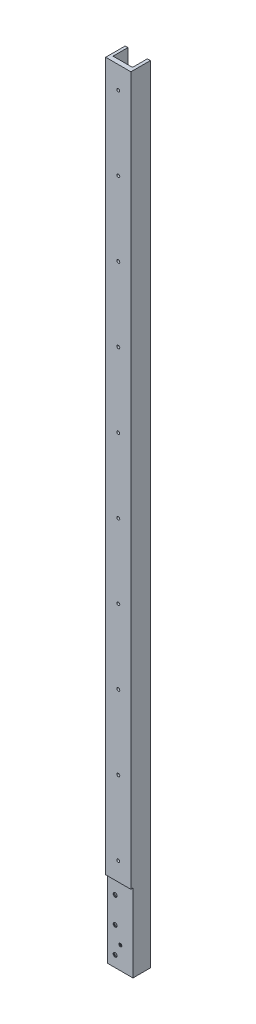
ISO-10303-21;
HEADER;
FILE_DESCRIPTION(('STEP AP214'),'2;1');
FILE_NAME('part.step','',(''),(''),'','','');
FILE_SCHEMA(('AUTOMOTIVE_DESIGN { 1 0 10303 214 1 1 1 1 }'));
ENDSEC;
DATA;
#1=APPLICATION_CONTEXT('core data for automotive mechanical design processes');
#2=APPLICATION_PROTOCOL_DEFINITION('international standard','automotive_design',2000,#1);
#3=PRODUCT_CONTEXT('',#1,'mechanical');
#4=PRODUCT('Part','Part','',(#3));
#5=PRODUCT_RELATED_PRODUCT_CATEGORY('part','',(#4));
#6=PRODUCT_DEFINITION_FORMATION('','',#4);
#7=PRODUCT_DEFINITION_CONTEXT('part definition',#1,'design');
#8=PRODUCT_DEFINITION('design','',#6,#7);
#9=PRODUCT_DEFINITION_SHAPE('','',#8);
#10=(LENGTH_UNIT() NAMED_UNIT(*) SI_UNIT(.MILLI.,.METRE.));
#11=(NAMED_UNIT(*) PLANE_ANGLE_UNIT() SI_UNIT($,.RADIAN.));
#12=(NAMED_UNIT(*) SI_UNIT($,.STERADIAN.) SOLID_ANGLE_UNIT());
#13=UNCERTAINTY_MEASURE_WITH_UNIT(LENGTH_MEASURE(1.E-05),#10,'distance_accuracy_value','');
#14=(GEOMETRIC_REPRESENTATION_CONTEXT(3) GLOBAL_UNCERTAINTY_ASSIGNED_CONTEXT((#13)) GLOBAL_UNIT_ASSIGNED_CONTEXT((#10,
#11,#12)) REPRESENTATION_CONTEXT('',''));
#15=CARTESIAN_POINT('',(0.,0.,0.));
#16=DIRECTION('',(0.,0.,1.));
#17=DIRECTION('',(1.,0.,0.));
#18=AXIS2_PLACEMENT_3D('',#15,#16,#17);
#19=CARTESIAN_POINT('',(-43.18,-1221.28003368592,33.3248));
#20=DIRECTION('',(1.,0.,0.));
#21=DIRECTION('',(0.,0.,-1.));
#22=AXIS2_PLACEMENT_3D('',#19,#20,#21);
#23=PLANE('',#22);
#24=DIRECTION('',(0.,0.,-1.));
#25=VECTOR('',#24,1.);
#26=CARTESIAN_POINT('',(-43.18,-1087.93003368592,33.3248));
#27=LINE('',#26,#25);
#28=CARTESIAN_POINT('',(-43.18,-1087.93003368592,33.3248));
#29=VERTEX_POINT('',#28);
#30=CARTESIAN_POINT('',(-43.18,-1087.93003368592,29.7688));
#31=VERTEX_POINT('',#30);
#32=EDGE_CURVE('E121',#29,#31,#27,.T.);
#33=ORIENTED_EDGE('',*,*,#32,.F.);
#34=DIRECTION('',(0.,-1.,0.));
#35=VECTOR('',#34,1.);
#36=CARTESIAN_POINT('',(-43.18,-1221.28003368592,33.3248));
#37=LINE('',#36,#35);
#38=CARTESIAN_POINT('',(-43.18,124.919966314081,33.3248));
#39=VERTEX_POINT('',#38);
#40=EDGE_CURVE('E289',#39,#29,#37,.T.);
#41=ORIENTED_EDGE('',*,*,#40,.F.);
#42=DIRECTION('',(0.,0.,-1.));
#43=VECTOR('',#42,1.);
#44=CARTESIAN_POINT('',(-43.18,124.919966314081,33.3248));
#45=LINE('',#44,#43);
#46=CARTESIAN_POINT('',(-43.18,124.919966314081,0.));
#47=VERTEX_POINT('',#46);
#48=EDGE_CURVE('E297',#39,#47,#45,.T.);
#49=ORIENTED_EDGE('',*,*,#48,.T.);
#50=DIRECTION('',(0.,-1.,0.));
#51=VECTOR('',#50,1.);
#52=CARTESIAN_POINT('',(-43.18,-1221.28003368592,0.));
#53=LINE('',#52,#51);
#54=CARTESIAN_POINT('',(-43.18,-1221.28003368592,0.));
#55=VERTEX_POINT('',#54);
#56=EDGE_CURVE('E135',#47,#55,#53,.T.);
#57=ORIENTED_EDGE('',*,*,#56,.T.);
#58=DIRECTION('',(0.,0.,-1.));
#59=VECTOR('',#58,1.);
#60=CARTESIAN_POINT('',(-43.18,-1221.28003368592,33.3248));
#61=LINE('',#60,#59);
#62=CARTESIAN_POINT('',(-43.18,-1221.28003368592,29.7688));
#63=VERTEX_POINT('',#62);
#64=EDGE_CURVE('E127',#63,#55,#61,.T.);
#65=ORIENTED_EDGE('',*,*,#64,.F.);
#66=DIRECTION('',(0.,1.,0.));
#67=VECTOR('',#66,1.);
#68=CARTESIAN_POINT('',(-43.18,-1221.28003368592,29.7688));
#69=LINE('',#68,#67);
#70=EDGE_CURVE('E110',#63,#31,#69,.T.);
#71=ORIENTED_EDGE('',*,*,#70,.T.);
#72=EDGE_LOOP('',(#33,#41,#49,#57,#65,#71));
#73=FACE_BOUND('',#72,.T.);
#74=ADVANCED_FACE('F33',(#73),#23,.F.);
#75=CARTESIAN_POINT('',(0.,-1221.28003368592,33.3248));
#76=DIRECTION('',(-1.,0.,0.));
#77=DIRECTION('',(0.,0.,1.));
#78=AXIS2_PLACEMENT_3D('',#75,#76,#77);
#79=PLANE('',#78);
#80=DIRECTION('',(0.,0.,-1.));
#81=VECTOR('',#80,1.);
#82=CARTESIAN_POINT('',(0.,-1087.93003368592,33.3248));
#83=LINE('',#82,#81);
#84=CARTESIAN_POINT('',(0.,-1087.93003368592,33.3248));
#85=VERTEX_POINT('',#84);
#86=CARTESIAN_POINT('',(0.,-1087.93003368592,29.7688));
#87=VERTEX_POINT('',#86);
#88=EDGE_CURVE('E49',#85,#87,#83,.T.);
#89=ORIENTED_EDGE('',*,*,#88,.T.);
#90=DIRECTION('',(0.,1.,0.));
#91=VECTOR('',#90,1.);
#92=CARTESIAN_POINT('',(0.,-1221.28003368592,29.7688));
#93=LINE('',#92,#91);
#94=CARTESIAN_POINT('',(0.,-1221.28003368592,29.7688));
#95=VERTEX_POINT('',#94);
#96=EDGE_CURVE('E199',#95,#87,#93,.T.);
#97=ORIENTED_EDGE('',*,*,#96,.F.);
#98=DIRECTION('',(0.,0.,-1.));
#99=VECTOR('',#98,1.);
#100=CARTESIAN_POINT('',(0.,-1221.28003368592,33.3248));
#101=LINE('',#100,#99);
#102=CARTESIAN_POINT('',(0.,-1221.28003368592,0.));
#103=VERTEX_POINT('',#102);
#104=EDGE_CURVE('E130',#95,#103,#101,.T.);
#105=ORIENTED_EDGE('',*,*,#104,.T.);
#106=DIRECTION('',(0.,1.,0.));
#107=VECTOR('',#106,1.);
#108=CARTESIAN_POINT('',(0.,-1221.28003368592,0.));
#109=LINE('',#108,#107);
#110=CARTESIAN_POINT('',(0.,124.919966314081,0.));
#111=VERTEX_POINT('',#110);
#112=EDGE_CURVE('E302',#103,#111,#109,.T.);
#113=ORIENTED_EDGE('',*,*,#112,.T.);
#114=DIRECTION('',(0.,0.,-1.));
#115=VECTOR('',#114,1.);
#116=CARTESIAN_POINT('',(0.,124.919966314081,33.3248));
#117=LINE('',#116,#115);
#118=CARTESIAN_POINT('',(0.,124.919966314081,33.3248));
#119=VERTEX_POINT('',#118);
#120=EDGE_CURVE('E138',#119,#111,#117,.T.);
#121=ORIENTED_EDGE('',*,*,#120,.F.);
#122=DIRECTION('',(0.,1.,0.));
#123=VECTOR('',#122,1.);
#124=CARTESIAN_POINT('',(0.,-1221.28003368592,33.3248));
#125=LINE('',#124,#123);
#126=EDGE_CURVE('E292',#85,#119,#125,.T.);
#127=ORIENTED_EDGE('',*,*,#126,.F.);
#128=EDGE_LOOP('',(#89,#97,#105,#113,#121,#127));
#129=FACE_BOUND('',#128,.T.);
#130=ADVANCED_FACE('F345',(#129),#79,.F.);
#131=CARTESIAN_POINT('',(0.,0.,33.3248));
#132=DIRECTION('',(0.,0.,-1.));
#133=DIRECTION('',(-1.,0.,0.));
#134=AXIS2_PLACEMENT_3D('',#131,#132,#133);
#135=PLANE('',#134);
#136=CARTESIAN_POINT('',(-21.5900000000044,86.8199663140807,33.3248));
#137=DIRECTION('',(0.,0.,-1.));
#138=DIRECTION('',(-1.,0.,0.));
#139=AXIS2_PLACEMENT_3D('',#136,#137,#138);
#140=CIRCLE('',#139,2.55269999999998);
#141=CARTESIAN_POINT('',(-24.1427000000044,86.8199663140807,33.3248));
#142=VERTEX_POINT('',#141);
#143=EDGE_CURVE('E142',#142,#142,#140,.T.);
#144=ORIENTED_EDGE('',*,*,#143,.T.);
#145=EDGE_LOOP('',(#144));
#146=FACE_BOUND('',#145,.T.);
#147=CARTESIAN_POINT('',(-21.590000000004,-40.1800336859193,33.3248));
#148=DIRECTION('',(0.,0.,-1.));
#149=DIRECTION('',(-1.,0.,0.));
#150=AXIS2_PLACEMENT_3D('',#147,#148,#149);
#151=CIRCLE('',#150,2.55269999999998);
#152=CARTESIAN_POINT('',(-24.142700000004,-40.1800336859193,33.3248));
#153=VERTEX_POINT('',#152);
#154=EDGE_CURVE('E147',#153,#153,#151,.T.);
#155=ORIENTED_EDGE('',*,*,#154,.T.);
#156=EDGE_LOOP('',(#155));
#157=FACE_BOUND('',#156,.T.);
#158=CARTESIAN_POINT('',(-21.5900000000035,-167.180033685919,33.3248));
#159=DIRECTION('',(0.,0.,-1.));
#160=DIRECTION('',(-1.,0.,0.));
#161=AXIS2_PLACEMENT_3D('',#158,#159,#160);
#162=CIRCLE('',#161,2.55269999999998);
#163=CARTESIAN_POINT('',(-24.1427000000035,-167.180033685919,33.3248));
#164=VERTEX_POINT('',#163);
#165=EDGE_CURVE('E152',#164,#164,#162,.T.);
#166=ORIENTED_EDGE('',*,*,#165,.T.);
#167=EDGE_LOOP('',(#166));
#168=FACE_BOUND('',#167,.T.);
#169=CARTESIAN_POINT('',(-21.5900000000031,-294.180033685919,33.3248));
#170=DIRECTION('',(0.,0.,-1.));
#171=DIRECTION('',(-1.,0.,0.));
#172=AXIS2_PLACEMENT_3D('',#169,#170,#171);
#173=CIRCLE('',#172,2.55269999999998);
#174=CARTESIAN_POINT('',(-24.1427000000031,-294.180033685919,33.3248));
#175=VERTEX_POINT('',#174);
#176=EDGE_CURVE('E157',#175,#175,#173,.T.);
#177=ORIENTED_EDGE('',*,*,#176,.T.);
#178=EDGE_LOOP('',(#177));
#179=FACE_BOUND('',#178,.T.);
#180=CARTESIAN_POINT('',(-21.5900000000027,-421.180033685919,33.3248));
#181=DIRECTION('',(0.,0.,-1.));
#182=DIRECTION('',(-1.,0.,0.));
#183=AXIS2_PLACEMENT_3D('',#180,#181,#182);
#184=CIRCLE('',#183,2.55269999999998);
#185=CARTESIAN_POINT('',(-24.1427000000026,-421.180033685919,33.3248));
#186=VERTEX_POINT('',#185);
#187=EDGE_CURVE('E162',#186,#186,#184,.T.);
#188=ORIENTED_EDGE('',*,*,#187,.T.);
#189=EDGE_LOOP('',(#188));
#190=FACE_BOUND('',#189,.T.);
#191=CARTESIAN_POINT('',(-21.5900000000022,-548.180033685919,33.3248));
#192=DIRECTION('',(0.,0.,-1.));
#193=DIRECTION('',(-1.,0.,0.));
#194=AXIS2_PLACEMENT_3D('',#191,#192,#193);
#195=CIRCLE('',#194,2.55269999999998);
#196=CARTESIAN_POINT('',(-24.1427000000022,-548.180033685919,33.3248));
#197=VERTEX_POINT('',#196);
#198=EDGE_CURVE('E167',#197,#197,#195,.T.);
#199=ORIENTED_EDGE('',*,*,#198,.T.);
#200=EDGE_LOOP('',(#199));
#201=FACE_BOUND('',#200,.T.);
#202=CARTESIAN_POINT('',(-21.5900000000018,-675.180033685919,33.3248));
#203=DIRECTION('',(0.,0.,-1.));
#204=DIRECTION('',(-1.,0.,0.));
#205=AXIS2_PLACEMENT_3D('',#202,#203,#204);
#206=CIRCLE('',#205,2.55269999999998);
#207=CARTESIAN_POINT('',(-24.1427000000018,-675.180033685919,33.3248));
#208=VERTEX_POINT('',#207);
#209=EDGE_CURVE('E172',#208,#208,#206,.T.);
#210=ORIENTED_EDGE('',*,*,#209,.T.);
#211=EDGE_LOOP('',(#210));
#212=FACE_BOUND('',#211,.T.);
#213=CARTESIAN_POINT('',(-21.5900000000013,-802.180033685919,33.3248));
#214=DIRECTION('',(0.,0.,-1.));
#215=DIRECTION('',(-1.,0.,0.));
#216=AXIS2_PLACEMENT_3D('',#213,#214,#215);
#217=CIRCLE('',#216,2.55269999999998);
#218=CARTESIAN_POINT('',(-24.1427000000013,-802.180033685919,33.3248));
#219=VERTEX_POINT('',#218);
#220=EDGE_CURVE('E177',#219,#219,#217,.T.);
#221=ORIENTED_EDGE('',*,*,#220,.T.);
#222=EDGE_LOOP('',(#221));
#223=FACE_BOUND('',#222,.T.);
#224=CARTESIAN_POINT('',(-21.5900000000009,-929.180033685919,33.3248));
#225=DIRECTION('',(0.,0.,-1.));
#226=DIRECTION('',(-1.,0.,0.));
#227=AXIS2_PLACEMENT_3D('',#224,#225,#226);
#228=CIRCLE('',#227,2.55269999999998);
#229=CARTESIAN_POINT('',(-24.1427000000009,-929.180033685919,33.3248));
#230=VERTEX_POINT('',#229);
#231=EDGE_CURVE('E182',#230,#230,#228,.T.);
#232=ORIENTED_EDGE('',*,*,#231,.T.);
#233=EDGE_LOOP('',(#232));
#234=FACE_BOUND('',#233,.T.);
#235=CARTESIAN_POINT('',(-21.5900000000004,-1056.18003368592,33.3248));
#236=DIRECTION('',(0.,0.,-1.));
#237=DIRECTION('',(-1.,0.,0.));
#238=AXIS2_PLACEMENT_3D('',#235,#236,#237);
#239=CIRCLE('',#238,2.55269999999998);
#240=CARTESIAN_POINT('',(-24.1427000000004,-1056.18003368592,33.3248));
#241=VERTEX_POINT('',#240);
#242=EDGE_CURVE('E187',#241,#241,#239,.T.);
#243=ORIENTED_EDGE('',*,*,#242,.T.);
#244=EDGE_LOOP('',(#243));
#245=FACE_BOUND('',#244,.T.);
#246=DIRECTION('',(1.,0.,0.));
#247=VECTOR('',#246,1.);
#248=CARTESIAN_POINT('',(-43.18,-1087.93003368592,33.3248));
#249=LINE('',#248,#247);
#250=EDGE_CURVE('E196',#29,#85,#249,.T.);
#251=ORIENTED_EDGE('',*,*,#250,.T.);
#252=ORIENTED_EDGE('',*,*,#126,.T.);
#253=DIRECTION('',(-1.,0.,0.));
#254=VECTOR('',#253,1.);
#255=CARTESIAN_POINT('',(-43.18,124.919966314081,33.3248));
#256=LINE('',#255,#254);
#257=EDGE_CURVE('E295',#119,#39,#256,.T.);
#258=ORIENTED_EDGE('',*,*,#257,.T.);
#259=ORIENTED_EDGE('',*,*,#40,.T.);
#260=EDGE_LOOP('',(#251,#252,#258,#259));
#261=FACE_BOUND('',#260,.T.);
#262=ADVANCED_FACE('F350',(#146,#157,#168,#179,#190,#201,#212,#223,#234,#245,#261),#135,.F.);
#263=CARTESIAN_POINT('',(0.,0.,0.));
#264=DIRECTION('',(0.,0.,-1.));
#265=DIRECTION('',(-1.,0.,0.));
#266=AXIS2_PLACEMENT_3D('',#263,#264,#265);
#267=PLANE('',#266);
#268=DIRECTION('',(1.,0.,0.));
#269=VECTOR('',#268,1.);
#270=CARTESIAN_POINT('',(-43.18,-1221.28003368592,0.));
#271=LINE('',#270,#269);
#272=CARTESIAN_POINT('',(-5.1435,-1221.28003368592,0.));
#273=VERTEX_POINT('',#272);
#274=EDGE_CURVE('E299',#273,#103,#271,.T.);
#275=ORIENTED_EDGE('',*,*,#274,.F.);
#276=DIRECTION('',(0.,1.,0.));
#277=VECTOR('',#276,1.);
#278=CARTESIAN_POINT('',(-5.1435,0.,0.));
#279=LINE('',#278,#277);
#280=CARTESIAN_POINT('',(-5.1435,124.919966314081,0.));
#281=VERTEX_POINT('',#280);
#282=EDGE_CURVE('E41',#273,#281,#279,.T.);
#283=ORIENTED_EDGE('',*,*,#282,.T.);
#284=DIRECTION('',(-1.,0.,0.));
#285=VECTOR('',#284,1.);
#286=CARTESIAN_POINT('',(-43.18,124.919966314081,0.));
#287=LINE('',#286,#285);
#288=EDGE_CURVE('E293',#111,#281,#287,.T.);
#289=ORIENTED_EDGE('',*,*,#288,.F.);
#290=ORIENTED_EDGE('',*,*,#112,.F.);
#291=EDGE_LOOP('',(#275,#283,#289,#290));
#292=FACE_BOUND('',#291,.T.);
#293=ADVANCED_FACE('F320',(#292),#267,.T.);
#294=CARTESIAN_POINT('',(-43.18,-1221.28003368592,33.3248));
#295=DIRECTION('',(0.,1.,0.));
#296=DIRECTION('',(0.,0.,1.));
#297=AXIS2_PLACEMENT_3D('',#294,#295,#296);
#298=PLANE('',#297);
#299=ORIENTED_EDGE('',*,*,#104,.F.);
#300=DIRECTION('',(1.,0.,0.));
#301=VECTOR('',#300,1.);
#302=CARTESIAN_POINT('',(-43.18,-1221.28003368592,29.7688));
#303=LINE('',#302,#301);
#304=EDGE_CURVE('E115',#63,#95,#303,.T.);
#305=ORIENTED_EDGE('',*,*,#304,.F.);
#306=ORIENTED_EDGE('',*,*,#64,.T.);
#307=CARTESIAN_POINT('',(-38.481,-1221.28003368592,0.));
#308=VERTEX_POINT('',#307);
#309=EDGE_CURVE('E300',#55,#308,#271,.T.);
#310=ORIENTED_EDGE('',*,*,#309,.T.);
#311=DIRECTION('',(0.,0.,1.));
#312=VECTOR('',#311,1.);
#313=CARTESIAN_POINT('',(-38.481,-1221.28003368592,-7.73428244373345));
#314=LINE('',#313,#312);
#315=CARTESIAN_POINT('',(-38.481,-1221.28003368592,25.3873));
#316=VERTEX_POINT('',#315);
#317=EDGE_CURVE('E271',#308,#316,#314,.T.);
#318=ORIENTED_EDGE('',*,*,#317,.T.);
#319=DIRECTION('',(1.,0.,0.));
#320=VECTOR('',#319,1.);
#321=CARTESIAN_POINT('',(-38.481,-1221.28003368592,25.3873));
#322=LINE('',#321,#320);
#323=CARTESIAN_POINT('',(-5.1435,-1221.28003368592,25.3873));
#324=VERTEX_POINT('',#323);
#325=EDGE_CURVE('E274',#316,#324,#322,.T.);
#326=ORIENTED_EDGE('',*,*,#325,.T.);
#327=DIRECTION('',(0.,0.,1.));
#328=VECTOR('',#327,1.);
#329=CARTESIAN_POINT('',(-5.1435,-1221.28003368592,-7.73428244373345));
#330=LINE('',#329,#328);
#331=EDGE_CURVE('E277',#273,#324,#330,.T.);
#332=ORIENTED_EDGE('',*,*,#331,.F.);
#333=ORIENTED_EDGE('',*,*,#274,.T.);
#334=EDGE_LOOP('',(#299,#305,#306,#310,#318,#326,#332,#333));
#335=FACE_BOUND('',#334,.T.);
#336=ADVANCED_FACE('F125',(#335),#298,.F.);
#337=CARTESIAN_POINT('',(-43.18,124.919966314081,33.3248));
#338=DIRECTION('',(0.,-1.,0.));
#339=DIRECTION('',(0.,0.,-1.));
#340=AXIS2_PLACEMENT_3D('',#337,#338,#339);
#341=PLANE('',#340);
#342=DIRECTION('',(1.,0.,0.));
#343=VECTOR('',#342,1.);
#344=CARTESIAN_POINT('',(-38.481,124.919966314081,25.3873));
#345=LINE('',#344,#343);
#346=CARTESIAN_POINT('',(-38.481,124.919966314081,25.3873));
#347=VERTEX_POINT('',#346);
#348=CARTESIAN_POINT('',(-5.1435,124.919966314081,25.3873));
#349=VERTEX_POINT('',#348);
#350=EDGE_CURVE('E281',#347,#349,#345,.T.);
#351=ORIENTED_EDGE('',*,*,#350,.F.);
#352=DIRECTION('',(0.,0.,1.));
#353=VECTOR('',#352,1.);
#354=CARTESIAN_POINT('',(-38.481,124.919966314081,-7.73428244373345));
#355=LINE('',#354,#353);
#356=CARTESIAN_POINT('',(-38.481,124.919966314081,0.));
#357=VERTEX_POINT('',#356);
#358=EDGE_CURVE('E145',#357,#347,#355,.T.);
#359=ORIENTED_EDGE('',*,*,#358,.F.);
#360=EDGE_CURVE('E304',#357,#47,#287,.T.);
#361=ORIENTED_EDGE('',*,*,#360,.T.);
#362=ORIENTED_EDGE('',*,*,#48,.F.);
#363=ORIENTED_EDGE('',*,*,#257,.F.);
#364=ORIENTED_EDGE('',*,*,#120,.T.);
#365=ORIENTED_EDGE('',*,*,#288,.T.);
#366=DIRECTION('',(0.,0.,1.));
#367=VECTOR('',#366,1.);
#368=CARTESIAN_POINT('',(-5.1435,124.919966314081,-7.73428244373345));
#369=LINE('',#368,#367);
#370=EDGE_CURVE('E57',#281,#349,#369,.T.);
#371=ORIENTED_EDGE('',*,*,#370,.T.);
#372=EDGE_LOOP('',(#351,#359,#361,#362,#363,#364,#365,#371));
#373=FACE_BOUND('',#372,.T.);
#374=ADVANCED_FACE('F313',(#373),#341,.F.);
#375=DIRECTION('',(0.,1.,0.));
#376=VECTOR('',#375,1.);
#377=CARTESIAN_POINT('',(-38.481,0.,0.));
#378=LINE('',#377,#376);
#379=EDGE_CURVE('E11',#308,#357,#378,.T.);
#380=ORIENTED_EDGE('',*,*,#379,.F.);
#381=ORIENTED_EDGE('',*,*,#309,.F.);
#382=ORIENTED_EDGE('',*,*,#56,.F.);
#383=ORIENTED_EDGE('',*,*,#360,.F.);
#384=EDGE_LOOP('',(#380,#381,#382,#383));
#385=FACE_BOUND('',#384,.T.);
#386=ADVANCED_FACE('F332',(#385),#267,.T.);
#387=CARTESIAN_POINT('',(-38.481,-1221.28003368592,-7.73428244373345));
#388=DIRECTION('',(-1.,0.,0.));
#389=DIRECTION('',(0.,0.,1.));
#390=AXIS2_PLACEMENT_3D('',#387,#388,#389);
#391=PLANE('',#390);
#392=ORIENTED_EDGE('',*,*,#379,.T.);
#393=ORIENTED_EDGE('',*,*,#358,.T.);
#394=DIRECTION('',(0.,1.,0.));
#395=VECTOR('',#394,1.);
#396=CARTESIAN_POINT('',(-38.481,-1221.28003368592,25.3873));
#397=LINE('',#396,#395);
#398=EDGE_CURVE('E279',#316,#347,#397,.T.);
#399=ORIENTED_EDGE('',*,*,#398,.F.);
#400=ORIENTED_EDGE('',*,*,#317,.F.);
#401=EDGE_LOOP('',(#392,#393,#399,#400));
#402=FACE_BOUND('',#401,.T.);
#403=ADVANCED_FACE('F333',(#402),#391,.F.);
#404=CARTESIAN_POINT('',(-5.1435,-1221.28003368592,-7.73428244373345));
#405=DIRECTION('',(-1.,0.,0.));
#406=DIRECTION('',(0.,0.,1.));
#407=AXIS2_PLACEMENT_3D('',#404,#405,#406);
#408=PLANE('',#407);
#409=ORIENTED_EDGE('',*,*,#331,.T.);
#410=DIRECTION('',(0.,1.,0.));
#411=VECTOR('',#410,1.);
#412=CARTESIAN_POINT('',(-5.1435,-1221.28003368592,25.3873));
#413=LINE('',#412,#411);
#414=EDGE_CURVE('E285',#324,#349,#413,.T.);
#415=ORIENTED_EDGE('',*,*,#414,.T.);
#416=ORIENTED_EDGE('',*,*,#370,.F.);
#417=ORIENTED_EDGE('',*,*,#282,.F.);
#418=EDGE_LOOP('',(#409,#415,#416,#417));
#419=FACE_BOUND('',#418,.T.);
#420=ADVANCED_FACE('F322',(#419),#408,.T.);
#421=CARTESIAN_POINT('',(-38.481,-1221.28003368592,25.3873));
#422=DIRECTION('',(0.,0.,1.));
#423=DIRECTION('',(1.,0.,0.));
#424=AXIS2_PLACEMENT_3D('',#421,#422,#423);
#425=PLANE('',#424);
#426=CARTESIAN_POINT('',(-30.4799998896747,-1157.78003327334,25.3873));
#427=DIRECTION('',(0.,0.,-1.));
#428=DIRECTION('',(-1.,0.,0.));
#429=AXIS2_PLACEMENT_3D('',#426,#427,#428);
#430=CIRCLE('',#429,6.6597022);
#431=CARTESIAN_POINT('',(-37.1397020896747,-1157.78003327334,25.3873));
#432=VERTEX_POINT('',#431);
#433=EDGE_CURVE('E706',#432,#432,#430,.T.);
#434=ORIENTED_EDGE('',*,*,#433,.F.);
#435=EDGE_LOOP('',(#434));
#436=FACE_BOUND('',#435,.T.);
#437=CARTESIAN_POINT('',(-30.4800000007231,-1202.23003327334,25.3873));
#438=DIRECTION('',(0.,0.,-1.));
#439=DIRECTION('',(-1.,0.,0.));
#440=AXIS2_PLACEMENT_3D('',#437,#438,#439);
#441=CIRCLE('',#440,6.6597022);
#442=CARTESIAN_POINT('',(-37.1397022007231,-1202.23003327334,25.3873));
#443=VERTEX_POINT('',#442);
#444=EDGE_CURVE('E210',#443,#443,#441,.T.);
#445=ORIENTED_EDGE('',*,*,#444,.F.);
#446=EDGE_LOOP('',(#445));
#447=FACE_BOUND('',#446,.T.);
#448=CARTESIAN_POINT('',(-30.4799997786267,-1113.33003327334,25.3873));
#449=DIRECTION('',(0.,0.,-1.));
#450=DIRECTION('',(-1.,0.,0.));
#451=AXIS2_PLACEMENT_3D('',#448,#449,#450);
#452=CIRCLE('',#451,6.6597022);
#453=CARTESIAN_POINT('',(-37.1397019786267,-1113.33003327334,25.3873));
#454=VERTEX_POINT('',#453);
#455=EDGE_CURVE('E203',#454,#454,#452,.T.);
#456=ORIENTED_EDGE('',*,*,#455,.F.);
#457=EDGE_LOOP('',(#456));
#458=FACE_BOUND('',#457,.T.);
#459=CARTESIAN_POINT('',(-21.59,-1183.18003368592,25.3873));
#460=DIRECTION('',(0.,0.,-1.));
#461=DIRECTION('',(-1.,0.,0.));
#462=AXIS2_PLACEMENT_3D('',#459,#460,#461);
#463=CIRCLE('',#462,5.1103022);
#464=CARTESIAN_POINT('',(-26.7003022,-1183.18003368592,25.3873));
#465=VERTEX_POINT('',#464);
#466=EDGE_CURVE('E195',#465,#465,#463,.T.);
#467=ORIENTED_EDGE('',*,*,#466,.F.);
#468=EDGE_LOOP('',(#467));
#469=FACE_BOUND('',#468,.T.);
#470=CARTESIAN_POINT('',(-21.5900000000004,-1056.18003368592,25.3873));
#471=DIRECTION('',(0.,0.,-1.));
#472=DIRECTION('',(-1.,0.,0.));
#473=AXIS2_PLACEMENT_3D('',#470,#471,#472);
#474=CIRCLE('',#473,5.1103022);
#475=CARTESIAN_POINT('',(-26.7003022000004,-1056.18003368592,25.3873));
#476=VERTEX_POINT('',#475);
#477=EDGE_CURVE('E230',#476,#476,#474,.T.);
#478=ORIENTED_EDGE('',*,*,#477,.F.);
#479=EDGE_LOOP('',(#478));
#480=FACE_BOUND('',#479,.T.);
#481=CARTESIAN_POINT('',(-21.5900000000009,-929.180033685919,25.3873));
#482=DIRECTION('',(0.,0.,-1.));
#483=DIRECTION('',(-1.,0.,0.));
#484=AXIS2_PLACEMENT_3D('',#481,#482,#483);
#485=CIRCLE('',#484,5.1103022);
#486=CARTESIAN_POINT('',(-26.7003022000009,-929.180033685919,25.3873));
#487=VERTEX_POINT('',#486);
#488=EDGE_CURVE('E190',#487,#487,#485,.T.);
#489=ORIENTED_EDGE('',*,*,#488,.F.);
#490=EDGE_LOOP('',(#489));
#491=FACE_BOUND('',#490,.T.);
#492=CARTESIAN_POINT('',(-21.5900000000013,-802.180033685919,25.3873));
#493=DIRECTION('',(0.,0.,-1.));
#494=DIRECTION('',(-1.,0.,0.));
#495=AXIS2_PLACEMENT_3D('',#492,#493,#494);
#496=CIRCLE('',#495,5.1103022);
#497=CARTESIAN_POINT('',(-26.7003022000013,-802.180033685919,25.3873));
#498=VERTEX_POINT('',#497);
#499=EDGE_CURVE('E185',#498,#498,#496,.T.);
#500=ORIENTED_EDGE('',*,*,#499,.F.);
#501=EDGE_LOOP('',(#500));
#502=FACE_BOUND('',#501,.T.);
#503=CARTESIAN_POINT('',(-21.5900000000018,-675.180033685919,25.3873));
#504=DIRECTION('',(0.,0.,-1.));
#505=DIRECTION('',(-1.,0.,0.));
#506=AXIS2_PLACEMENT_3D('',#503,#504,#505);
#507=CIRCLE('',#506,5.1103022);
#508=CARTESIAN_POINT('',(-26.7003022000018,-675.180033685919,25.3873));
#509=VERTEX_POINT('',#508);
#510=EDGE_CURVE('E180',#509,#509,#507,.T.);
#511=ORIENTED_EDGE('',*,*,#510,.F.);
#512=EDGE_LOOP('',(#511));
#513=FACE_BOUND('',#512,.T.);
#514=CARTESIAN_POINT('',(-21.5900000000022,-548.180033685919,25.3873));
#515=DIRECTION('',(0.,0.,-1.));
#516=DIRECTION('',(-1.,0.,0.));
#517=AXIS2_PLACEMENT_3D('',#514,#515,#516);
#518=CIRCLE('',#517,5.1103022);
#519=CARTESIAN_POINT('',(-26.7003022000022,-548.180033685919,25.3873));
#520=VERTEX_POINT('',#519);
#521=EDGE_CURVE('E175',#520,#520,#518,.T.);
#522=ORIENTED_EDGE('',*,*,#521,.F.);
#523=EDGE_LOOP('',(#522));
#524=FACE_BOUND('',#523,.T.);
#525=CARTESIAN_POINT('',(-21.5900000000027,-421.180033685919,25.3873));
#526=DIRECTION('',(0.,0.,-1.));
#527=DIRECTION('',(-1.,0.,0.));
#528=AXIS2_PLACEMENT_3D('',#525,#526,#527);
#529=CIRCLE('',#528,5.1103022);
#530=CARTESIAN_POINT('',(-26.7003022000027,-421.180033685919,25.3873));
#531=VERTEX_POINT('',#530);
#532=EDGE_CURVE('E170',#531,#531,#529,.T.);
#533=ORIENTED_EDGE('',*,*,#532,.F.);
#534=EDGE_LOOP('',(#533));
#535=FACE_BOUND('',#534,.T.);
#536=CARTESIAN_POINT('',(-21.5900000000031,-294.180033685919,25.3873));
#537=DIRECTION('',(0.,0.,-1.));
#538=DIRECTION('',(-1.,0.,0.));
#539=AXIS2_PLACEMENT_3D('',#536,#537,#538);
#540=CIRCLE('',#539,5.1103022);
#541=CARTESIAN_POINT('',(-26.7003022000031,-294.180033685919,25.3873));
#542=VERTEX_POINT('',#541);
#543=EDGE_CURVE('E165',#542,#542,#540,.T.);
#544=ORIENTED_EDGE('',*,*,#543,.F.);
#545=EDGE_LOOP('',(#544));
#546=FACE_BOUND('',#545,.T.);
#547=CARTESIAN_POINT('',(-21.5900000000035,-167.180033685919,25.3873));
#548=DIRECTION('',(0.,0.,-1.));
#549=DIRECTION('',(-1.,0.,0.));
#550=AXIS2_PLACEMENT_3D('',#547,#548,#549);
#551=CIRCLE('',#550,5.1103022);
#552=CARTESIAN_POINT('',(-26.7003022000035,-167.180033685919,25.3873));
#553=VERTEX_POINT('',#552);
#554=EDGE_CURVE('E160',#553,#553,#551,.T.);
#555=ORIENTED_EDGE('',*,*,#554,.F.);
#556=EDGE_LOOP('',(#555));
#557=FACE_BOUND('',#556,.T.);
#558=CARTESIAN_POINT('',(-21.590000000004,-40.1800336859193,25.3873));
#559=DIRECTION('',(0.,0.,-1.));
#560=DIRECTION('',(-1.,0.,0.));
#561=AXIS2_PLACEMENT_3D('',#558,#559,#560);
#562=CIRCLE('',#561,5.1103022);
#563=CARTESIAN_POINT('',(-26.700302200004,-40.1800336859193,25.3873));
#564=VERTEX_POINT('',#563);
#565=EDGE_CURVE('E155',#564,#564,#562,.T.);
#566=ORIENTED_EDGE('',*,*,#565,.F.);
#567=EDGE_LOOP('',(#566));
#568=FACE_BOUND('',#567,.T.);
#569=CARTESIAN_POINT('',(-21.5900000000044,86.8199663140807,25.3873));
#570=DIRECTION('',(0.,0.,-1.));
#571=DIRECTION('',(-1.,0.,0.));
#572=AXIS2_PLACEMENT_3D('',#569,#570,#571);
#573=CIRCLE('',#572,5.1103022);
#574=CARTESIAN_POINT('',(-26.7003022000044,86.8199663140807,25.3873));
#575=VERTEX_POINT('',#574);
#576=EDGE_CURVE('E150',#575,#575,#573,.T.);
#577=ORIENTED_EDGE('',*,*,#576,.F.);
#578=EDGE_LOOP('',(#577));
#579=FACE_BOUND('',#578,.T.);
#580=ORIENTED_EDGE('',*,*,#350,.T.);
#581=ORIENTED_EDGE('',*,*,#414,.F.);
#582=ORIENTED_EDGE('',*,*,#325,.F.);
#583=ORIENTED_EDGE('',*,*,#398,.T.);
#584=EDGE_LOOP('',(#580,#581,#582,#583));
#585=FACE_BOUND('',#584,.T.);
#586=ADVANCED_FACE('F326',(#436,#447,#458,#469,#480,#491,#502,#513,#524,#535,#546,#557,#568,
#579,#585),#425,.F.);
#587=CARTESIAN_POINT('',(-21.5900000000044,86.8199663140807,25.3873));
#588=DIRECTION('',(0.,0.,-1.));
#589=DIRECTION('',(-1.,0.,0.));
#590=AXIS2_PLACEMENT_3D('',#587,#588,#589);
#591=CYLINDRICAL_SURFACE('',#590,2.55269999999998);
#592=CARTESIAN_POINT('',(-21.5900000000044,86.8199663140807,28.329484769119));
#593=DIRECTION('',(0.,0.,-1.));
#594=DIRECTION('',(-1.,0.,0.));
#595=AXIS2_PLACEMENT_3D('',#592,#593,#594);
#596=CIRCLE('',#595,2.55269999999999);
#597=CARTESIAN_POINT('',(-24.1427000000044,86.8199663140807,28.329484769119));
#598=VERTEX_POINT('',#597);
#599=EDGE_CURVE('E146',#598,#598,#596,.T.);
#600=ORIENTED_EDGE('',*,*,#599,.T.);
#601=EDGE_LOOP('',(#600));
#602=FACE_BOUND('',#601,.T.);
#603=ORIENTED_EDGE('',*,*,#143,.F.);
#604=EDGE_LOOP('',(#603));
#605=FACE_BOUND('',#604,.T.);
#606=ADVANCED_FACE('F394',(#602,#605),#591,.F.);
#607=CARTESIAN_POINT('',(-21.5900000000044,86.8199663140807,25.3873));
#608=DIRECTION('',(0.,0.,-1.));
#609=DIRECTION('',(-1.,0.,0.));
#610=AXIS2_PLACEMENT_3D('',#607,#608,#609);
#611=CONICAL_SURFACE('',#610,5.1103022,0.715584993317672);
#612=ORIENTED_EDGE('',*,*,#599,.F.);
#613=EDGE_LOOP('',(#612));
#614=FACE_BOUND('',#613,.T.);
#615=ORIENTED_EDGE('',*,*,#576,.T.);
#616=EDGE_LOOP('',(#615));
#617=FACE_BOUND('',#616,.T.);
#618=ADVANCED_FACE('F399',(#614,#617),#611,.F.);
#619=CARTESIAN_POINT('',(-21.590000000004,-40.1800336859193,25.3873));
#620=DIRECTION('',(0.,0.,-1.));
#621=DIRECTION('',(-1.,0.,0.));
#622=AXIS2_PLACEMENT_3D('',#619,#620,#621);
#623=CYLINDRICAL_SURFACE('',#622,2.55269999999998);
#624=CARTESIAN_POINT('',(-21.590000000004,-40.1800336859193,28.329484769119));
#625=DIRECTION('',(0.,0.,-1.));
#626=DIRECTION('',(-1.,0.,0.));
#627=AXIS2_PLACEMENT_3D('',#624,#625,#626);
#628=CIRCLE('',#627,2.55269999999999);
#629=CARTESIAN_POINT('',(-24.142700000004,-40.1800336859193,28.329484769119));
#630=VERTEX_POINT('',#629);
#631=EDGE_CURVE('E151',#630,#630,#628,.T.);
#632=ORIENTED_EDGE('',*,*,#631,.T.);
#633=EDGE_LOOP('',(#632));
#634=FACE_BOUND('',#633,.T.);
#635=ORIENTED_EDGE('',*,*,#154,.F.);
#636=EDGE_LOOP('',(#635));
#637=FACE_BOUND('',#636,.T.);
#638=ADVANCED_FACE('F409',(#634,#637),#623,.F.);
#639=CARTESIAN_POINT('',(-21.590000000004,-40.1800336859193,25.3873));
#640=DIRECTION('',(0.,0.,-1.));
#641=DIRECTION('',(-1.,0.,0.));
#642=AXIS2_PLACEMENT_3D('',#639,#640,#641);
#643=CONICAL_SURFACE('',#642,5.1103022,0.715584993317672);
#644=ORIENTED_EDGE('',*,*,#631,.F.);
#645=EDGE_LOOP('',(#644));
#646=FACE_BOUND('',#645,.T.);
#647=ORIENTED_EDGE('',*,*,#565,.T.);
#648=EDGE_LOOP('',(#647));
#649=FACE_BOUND('',#648,.T.);
#650=ADVANCED_FACE('F419',(#646,#649),#643,.F.);
#651=CARTESIAN_POINT('',(-21.5900000000035,-167.180033685919,25.3873));
#652=DIRECTION('',(0.,0.,-1.));
#653=DIRECTION('',(-1.,0.,0.));
#654=AXIS2_PLACEMENT_3D('',#651,#652,#653);
#655=CYLINDRICAL_SURFACE('',#654,2.55269999999998);
#656=CARTESIAN_POINT('',(-21.5900000000035,-167.180033685919,28.329484769119));
#657=DIRECTION('',(0.,0.,-1.));
#658=DIRECTION('',(-1.,0.,0.));
#659=AXIS2_PLACEMENT_3D('',#656,#657,#658);
#660=CIRCLE('',#659,2.55269999999999);
#661=CARTESIAN_POINT('',(-24.1427000000035,-167.180033685919,28.329484769119));
#662=VERTEX_POINT('',#661);
#663=EDGE_CURVE('E156',#662,#662,#660,.T.);
#664=ORIENTED_EDGE('',*,*,#663,.T.);
#665=EDGE_LOOP('',(#664));
#666=FACE_BOUND('',#665,.T.);
#667=ORIENTED_EDGE('',*,*,#165,.F.);
#668=EDGE_LOOP('',(#667));
#669=FACE_BOUND('',#668,.T.);
#670=ADVANCED_FACE('F429',(#666,#669),#655,.F.);
#671=CARTESIAN_POINT('',(-21.5900000000035,-167.180033685919,25.3873));
#672=DIRECTION('',(0.,0.,-1.));
#673=DIRECTION('',(-1.,0.,0.));
#674=AXIS2_PLACEMENT_3D('',#671,#672,#673);
#675=CONICAL_SURFACE('',#674,5.1103022,0.715584993317672);
#676=ORIENTED_EDGE('',*,*,#663,.F.);
#677=EDGE_LOOP('',(#676));
#678=FACE_BOUND('',#677,.T.);
#679=ORIENTED_EDGE('',*,*,#554,.T.);
#680=EDGE_LOOP('',(#679));
#681=FACE_BOUND('',#680,.T.);
#682=ADVANCED_FACE('F439',(#678,#681),#675,.F.);
#683=CARTESIAN_POINT('',(-21.5900000000031,-294.180033685919,25.3873));
#684=DIRECTION('',(0.,0.,-1.));
#685=DIRECTION('',(-1.,0.,0.));
#686=AXIS2_PLACEMENT_3D('',#683,#684,#685);
#687=CYLINDRICAL_SURFACE('',#686,2.55269999999998);
#688=CARTESIAN_POINT('',(-21.5900000000031,-294.180033685919,28.329484769119));
#689=DIRECTION('',(0.,0.,-1.));
#690=DIRECTION('',(-1.,0.,0.));
#691=AXIS2_PLACEMENT_3D('',#688,#689,#690);
#692=CIRCLE('',#691,2.55269999999999);
#693=CARTESIAN_POINT('',(-24.1427000000031,-294.180033685919,28.329484769119));
#694=VERTEX_POINT('',#693);
#695=EDGE_CURVE('E161',#694,#694,#692,.T.);
#696=ORIENTED_EDGE('',*,*,#695,.T.);
#697=EDGE_LOOP('',(#696));
#698=FACE_BOUND('',#697,.T.);
#699=ORIENTED_EDGE('',*,*,#176,.F.);
#700=EDGE_LOOP('',(#699));
#701=FACE_BOUND('',#700,.T.);
#702=ADVANCED_FACE('F449',(#698,#701),#687,.F.);
#703=CARTESIAN_POINT('',(-21.5900000000031,-294.180033685919,25.3873));
#704=DIRECTION('',(0.,0.,-1.));
#705=DIRECTION('',(-1.,0.,0.));
#706=AXIS2_PLACEMENT_3D('',#703,#704,#705);
#707=CONICAL_SURFACE('',#706,5.1103022,0.715584993317673);
#708=ORIENTED_EDGE('',*,*,#695,.F.);
#709=EDGE_LOOP('',(#708));
#710=FACE_BOUND('',#709,.T.);
#711=ORIENTED_EDGE('',*,*,#543,.T.);
#712=EDGE_LOOP('',(#711));
#713=FACE_BOUND('',#712,.T.);
#714=ADVANCED_FACE('F459',(#710,#713),#707,.F.);
#715=CARTESIAN_POINT('',(-21.5900000000027,-421.180033685919,25.3873));
#716=DIRECTION('',(0.,0.,-1.));
#717=DIRECTION('',(-1.,0.,0.));
#718=AXIS2_PLACEMENT_3D('',#715,#716,#717);
#719=CYLINDRICAL_SURFACE('',#718,2.55269999999998);
#720=CARTESIAN_POINT('',(-21.5900000000027,-421.180033685919,28.329484769119));
#721=DIRECTION('',(0.,0.,-1.));
#722=DIRECTION('',(-1.,0.,0.));
#723=AXIS2_PLACEMENT_3D('',#720,#721,#722);
#724=CIRCLE('',#723,2.55269999999999);
#725=CARTESIAN_POINT('',(-24.1427000000026,-421.180033685919,28.329484769119));
#726=VERTEX_POINT('',#725);
#727=EDGE_CURVE('E166',#726,#726,#724,.T.);
#728=ORIENTED_EDGE('',*,*,#727,.T.);
#729=EDGE_LOOP('',(#728));
#730=FACE_BOUND('',#729,.T.);
#731=ORIENTED_EDGE('',*,*,#187,.F.);
#732=EDGE_LOOP('',(#731));
#733=FACE_BOUND('',#732,.T.);
#734=ADVANCED_FACE('F469',(#730,#733),#719,.F.);
#735=CARTESIAN_POINT('',(-21.5900000000027,-421.180033685919,25.3873));
#736=DIRECTION('',(0.,0.,-1.));
#737=DIRECTION('',(-1.,0.,0.));
#738=AXIS2_PLACEMENT_3D('',#735,#736,#737);
#739=CONICAL_SURFACE('',#738,5.1103022,0.715584993317673);
#740=ORIENTED_EDGE('',*,*,#727,.F.);
#741=EDGE_LOOP('',(#740));
#742=FACE_BOUND('',#741,.T.);
#743=ORIENTED_EDGE('',*,*,#532,.T.);
#744=EDGE_LOOP('',(#743));
#745=FACE_BOUND('',#744,.T.);
#746=ADVANCED_FACE('F479',(#742,#745),#739,.F.);
#747=CARTESIAN_POINT('',(-21.5900000000022,-548.180033685919,25.3873));
#748=DIRECTION('',(0.,0.,-1.));
#749=DIRECTION('',(-1.,0.,0.));
#750=AXIS2_PLACEMENT_3D('',#747,#748,#749);
#751=CYLINDRICAL_SURFACE('',#750,2.55269999999998);
#752=CARTESIAN_POINT('',(-21.5900000000022,-548.180033685919,28.329484769119));
#753=DIRECTION('',(0.,0.,-1.));
#754=DIRECTION('',(-1.,0.,0.));
#755=AXIS2_PLACEMENT_3D('',#752,#753,#754);
#756=CIRCLE('',#755,2.55269999999999);
#757=CARTESIAN_POINT('',(-24.1427000000022,-548.180033685919,28.329484769119));
#758=VERTEX_POINT('',#757);
#759=EDGE_CURVE('E171',#758,#758,#756,.T.);
#760=ORIENTED_EDGE('',*,*,#759,.T.);
#761=EDGE_LOOP('',(#760));
#762=FACE_BOUND('',#761,.T.);
#763=ORIENTED_EDGE('',*,*,#198,.F.);
#764=EDGE_LOOP('',(#763));
#765=FACE_BOUND('',#764,.T.);
#766=ADVANCED_FACE('F489',(#762,#765),#751,.F.);
#767=CARTESIAN_POINT('',(-21.5900000000022,-548.180033685919,25.3873));
#768=DIRECTION('',(0.,0.,-1.));
#769=DIRECTION('',(-1.,0.,0.));
#770=AXIS2_PLACEMENT_3D('',#767,#768,#769);
#771=CONICAL_SURFACE('',#770,5.1103022,0.715584993317673);
#772=ORIENTED_EDGE('',*,*,#759,.F.);
#773=EDGE_LOOP('',(#772));
#774=FACE_BOUND('',#773,.T.);
#775=ORIENTED_EDGE('',*,*,#521,.T.);
#776=EDGE_LOOP('',(#775));
#777=FACE_BOUND('',#776,.T.);
#778=ADVANCED_FACE('F499',(#774,#777),#771,.F.);
#779=CARTESIAN_POINT('',(-21.5900000000018,-675.180033685919,25.3873));
#780=DIRECTION('',(0.,0.,-1.));
#781=DIRECTION('',(-1.,0.,0.));
#782=AXIS2_PLACEMENT_3D('',#779,#780,#781);
#783=CYLINDRICAL_SURFACE('',#782,2.55269999999998);
#784=CARTESIAN_POINT('',(-21.5900000000018,-675.180033685919,28.329484769119));
#785=DIRECTION('',(0.,0.,-1.));
#786=DIRECTION('',(-1.,0.,0.));
#787=AXIS2_PLACEMENT_3D('',#784,#785,#786);
#788=CIRCLE('',#787,2.55269999999999);
#789=CARTESIAN_POINT('',(-24.1427000000018,-675.180033685919,28.329484769119));
#790=VERTEX_POINT('',#789);
#791=EDGE_CURVE('E176',#790,#790,#788,.T.);
#792=ORIENTED_EDGE('',*,*,#791,.T.);
#793=EDGE_LOOP('',(#792));
#794=FACE_BOUND('',#793,.T.);
#795=ORIENTED_EDGE('',*,*,#209,.F.);
#796=EDGE_LOOP('',(#795));
#797=FACE_BOUND('',#796,.T.);
#798=ADVANCED_FACE('F509',(#794,#797),#783,.F.);
#799=CARTESIAN_POINT('',(-21.5900000000018,-675.180033685919,25.3873));
#800=DIRECTION('',(0.,0.,-1.));
#801=DIRECTION('',(-1.,0.,0.));
#802=AXIS2_PLACEMENT_3D('',#799,#800,#801);
#803=CONICAL_SURFACE('',#802,5.1103022,0.715584993317673);
#804=ORIENTED_EDGE('',*,*,#791,.F.);
#805=EDGE_LOOP('',(#804));
#806=FACE_BOUND('',#805,.T.);
#807=ORIENTED_EDGE('',*,*,#510,.T.);
#808=EDGE_LOOP('',(#807));
#809=FACE_BOUND('',#808,.T.);
#810=ADVANCED_FACE('F519',(#806,#809),#803,.F.);
#811=CARTESIAN_POINT('',(-21.5900000000013,-802.180033685919,25.3873));
#812=DIRECTION('',(0.,0.,-1.));
#813=DIRECTION('',(-1.,0.,0.));
#814=AXIS2_PLACEMENT_3D('',#811,#812,#813);
#815=CYLINDRICAL_SURFACE('',#814,2.55269999999998);
#816=CARTESIAN_POINT('',(-21.5900000000013,-802.180033685919,28.329484769119));
#817=DIRECTION('',(0.,0.,-1.));
#818=DIRECTION('',(-1.,0.,0.));
#819=AXIS2_PLACEMENT_3D('',#816,#817,#818);
#820=CIRCLE('',#819,2.55269999999999);
#821=CARTESIAN_POINT('',(-24.1427000000013,-802.180033685919,28.329484769119));
#822=VERTEX_POINT('',#821);
#823=EDGE_CURVE('E181',#822,#822,#820,.T.);
#824=ORIENTED_EDGE('',*,*,#823,.T.);
#825=EDGE_LOOP('',(#824));
#826=FACE_BOUND('',#825,.T.);
#827=ORIENTED_EDGE('',*,*,#220,.F.);
#828=EDGE_LOOP('',(#827));
#829=FACE_BOUND('',#828,.T.);
#830=ADVANCED_FACE('F529',(#826,#829),#815,.F.);
#831=CARTESIAN_POINT('',(-21.5900000000013,-802.180033685919,25.3873));
#832=DIRECTION('',(0.,0.,-1.));
#833=DIRECTION('',(-1.,0.,0.));
#834=AXIS2_PLACEMENT_3D('',#831,#832,#833);
#835=CONICAL_SURFACE('',#834,5.1103022,0.715584993317673);
#836=ORIENTED_EDGE('',*,*,#823,.F.);
#837=EDGE_LOOP('',(#836));
#838=FACE_BOUND('',#837,.T.);
#839=ORIENTED_EDGE('',*,*,#499,.T.);
#840=EDGE_LOOP('',(#839));
#841=FACE_BOUND('',#840,.T.);
#842=ADVANCED_FACE('F539',(#838,#841),#835,.F.);
#843=CARTESIAN_POINT('',(-21.5900000000009,-929.180033685919,25.3873));
#844=DIRECTION('',(0.,0.,-1.));
#845=DIRECTION('',(-1.,0.,0.));
#846=AXIS2_PLACEMENT_3D('',#843,#844,#845);
#847=CYLINDRICAL_SURFACE('',#846,2.55269999999998);
#848=CARTESIAN_POINT('',(-21.5900000000009,-929.180033685919,28.329484769119));
#849=DIRECTION('',(0.,0.,-1.));
#850=DIRECTION('',(-1.,0.,0.));
#851=AXIS2_PLACEMENT_3D('',#848,#849,#850);
#852=CIRCLE('',#851,2.55269999999999);
#853=CARTESIAN_POINT('',(-24.1427000000009,-929.180033685919,28.329484769119));
#854=VERTEX_POINT('',#853);
#855=EDGE_CURVE('E186',#854,#854,#852,.T.);
#856=ORIENTED_EDGE('',*,*,#855,.T.);
#857=EDGE_LOOP('',(#856));
#858=FACE_BOUND('',#857,.T.);
#859=ORIENTED_EDGE('',*,*,#231,.F.);
#860=EDGE_LOOP('',(#859));
#861=FACE_BOUND('',#860,.T.);
#862=ADVANCED_FACE('F549',(#858,#861),#847,.F.);
#863=CARTESIAN_POINT('',(-21.5900000000009,-929.180033685919,25.3873));
#864=DIRECTION('',(0.,0.,-1.));
#865=DIRECTION('',(-1.,0.,0.));
#866=AXIS2_PLACEMENT_3D('',#863,#864,#865);
#867=CONICAL_SURFACE('',#866,5.1103022,0.715584993317672);
#868=ORIENTED_EDGE('',*,*,#855,.F.);
#869=EDGE_LOOP('',(#868));
#870=FACE_BOUND('',#869,.T.);
#871=ORIENTED_EDGE('',*,*,#488,.T.);
#872=EDGE_LOOP('',(#871));
#873=FACE_BOUND('',#872,.T.);
#874=ADVANCED_FACE('F559',(#870,#873),#867,.F.);
#875=CARTESIAN_POINT('',(-21.5900000000004,-1056.18003368592,25.3873));
#876=DIRECTION('',(0.,0.,-1.));
#877=DIRECTION('',(-1.,0.,0.));
#878=AXIS2_PLACEMENT_3D('',#875,#876,#877);
#879=CYLINDRICAL_SURFACE('',#878,2.55269999999998);
#880=CARTESIAN_POINT('',(-21.5900000000004,-1056.18003368592,28.329484769119));
#881=DIRECTION('',(0.,0.,-1.));
#882=DIRECTION('',(-1.,0.,0.));
#883=AXIS2_PLACEMENT_3D('',#880,#881,#882);
#884=CIRCLE('',#883,2.55269999999999);
#885=CARTESIAN_POINT('',(-24.1427000000004,-1056.18003368592,28.329484769119));
#886=VERTEX_POINT('',#885);
#887=EDGE_CURVE('E191',#886,#886,#884,.T.);
#888=ORIENTED_EDGE('',*,*,#887,.T.);
#889=EDGE_LOOP('',(#888));
#890=FACE_BOUND('',#889,.T.);
#891=ORIENTED_EDGE('',*,*,#242,.F.);
#892=EDGE_LOOP('',(#891));
#893=FACE_BOUND('',#892,.T.);
#894=ADVANCED_FACE('F569',(#890,#893),#879,.F.);
#895=CARTESIAN_POINT('',(-21.5900000000004,-1056.18003368592,25.3873));
#896=DIRECTION('',(0.,0.,-1.));
#897=DIRECTION('',(-1.,0.,0.));
#898=AXIS2_PLACEMENT_3D('',#895,#896,#897);
#899=CONICAL_SURFACE('',#898,5.1103022,0.715584993317672);
#900=ORIENTED_EDGE('',*,*,#887,.F.);
#901=EDGE_LOOP('',(#900));
#902=FACE_BOUND('',#901,.T.);
#903=ORIENTED_EDGE('',*,*,#477,.T.);
#904=EDGE_LOOP('',(#903));
#905=FACE_BOUND('',#904,.T.);
#906=ADVANCED_FACE('F579',(#902,#905),#899,.F.);
#907=CARTESIAN_POINT('',(-21.59,-1183.18003368592,25.3873));
#908=DIRECTION('',(0.,0.,-1.));
#909=DIRECTION('',(-1.,0.,0.));
#910=AXIS2_PLACEMENT_3D('',#907,#908,#909);
#911=CYLINDRICAL_SURFACE('',#910,2.55269999999998);
#912=CARTESIAN_POINT('',(-21.59,-1183.18003368592,29.7688));
#913=DIRECTION('',(0.,0.,-1.));
#914=DIRECTION('',(-1.,0.,0.));
#915=AXIS2_PLACEMENT_3D('',#912,#913,#914);
#916=CIRCLE('',#915,2.55269999999998);
#917=CARTESIAN_POINT('',(-24.1427,-1183.18003368592,29.7688));
#918=VERTEX_POINT('',#917);
#919=EDGE_CURVE('E192',#918,#918,#916,.F.);
#920=ORIENTED_EDGE('',*,*,#919,.T.);
#921=EDGE_LOOP('',(#920));
#922=FACE_BOUND('',#921,.T.);
#923=CARTESIAN_POINT('',(-21.59,-1183.18003368592,28.329484769119));
#924=DIRECTION('',(0.,0.,-1.));
#925=DIRECTION('',(-1.,0.,0.));
#926=AXIS2_PLACEMENT_3D('',#923,#924,#925);
#927=CIRCLE('',#926,2.55269999999999);
#928=CARTESIAN_POINT('',(-24.1427,-1183.18003368592,28.329484769119));
#929=VERTEX_POINT('',#928);
#930=EDGE_CURVE('E227',#929,#929,#927,.T.);
#931=ORIENTED_EDGE('',*,*,#930,.T.);
#932=EDGE_LOOP('',(#931));
#933=FACE_BOUND('',#932,.T.);
#934=ADVANCED_FACE('F588',(#922,#933),#911,.F.);
#935=CARTESIAN_POINT('',(-21.59,-1183.18003368592,25.3873));
#936=DIRECTION('',(0.,0.,-1.));
#937=DIRECTION('',(-1.,0.,0.));
#938=AXIS2_PLACEMENT_3D('',#935,#936,#937);
#939=CONICAL_SURFACE('',#938,5.1103022,0.715584993317672);
#940=ORIENTED_EDGE('',*,*,#930,.F.);
#941=EDGE_LOOP('',(#940));
#942=FACE_BOUND('',#941,.T.);
#943=ORIENTED_EDGE('',*,*,#466,.T.);
#944=EDGE_LOOP('',(#943));
#945=FACE_BOUND('',#944,.T.);
#946=ADVANCED_FACE('F596',(#942,#945),#939,.F.);
#947=CARTESIAN_POINT('',(-43.18,-1221.28003368592,29.7688));
#948=DIRECTION('',(0.,0.,-1.));
#949=DIRECTION('',(-1.,0.,0.));
#950=AXIS2_PLACEMENT_3D('',#947,#948,#949);
#951=PLANE('',#950);
#952=CARTESIAN_POINT('',(-30.4799998896747,-1157.78003327334,29.7688));
#953=DIRECTION('',(0.,0.,-1.));
#954=DIRECTION('',(-1.,0.,0.));
#955=AXIS2_PLACEMENT_3D('',#952,#953,#954);
#956=CIRCLE('',#955,3.37819999999999);
#957=CARTESIAN_POINT('',(-33.8581998896747,-1157.78003327334,29.7688));
#958=VERTEX_POINT('',#957);
#959=EDGE_CURVE('E36',#958,#958,#956,.T.);
#960=ORIENTED_EDGE('',*,*,#959,.T.);
#961=EDGE_LOOP('',(#960));
#962=FACE_BOUND('',#961,.T.);
#963=CARTESIAN_POINT('',(-30.4800000007231,-1202.23003327334,29.7688));
#964=DIRECTION('',(0.,0.,-1.));
#965=DIRECTION('',(-1.,0.,0.));
#966=AXIS2_PLACEMENT_3D('',#963,#964,#965);
#967=CIRCLE('',#966,3.37819999999999);
#968=CARTESIAN_POINT('',(-33.8582000007231,-1202.23003327334,29.7688));
#969=VERTEX_POINT('',#968);
#970=EDGE_CURVE('E201',#969,#969,#967,.T.);
#971=ORIENTED_EDGE('',*,*,#970,.T.);
#972=EDGE_LOOP('',(#971));
#973=FACE_BOUND('',#972,.T.);
#974=CARTESIAN_POINT('',(-30.4799997786267,-1113.33003327334,29.7688));
#975=DIRECTION('',(0.,0.,-1.));
#976=DIRECTION('',(-1.,0.,0.));
#977=AXIS2_PLACEMENT_3D('',#974,#975,#976);
#978=CIRCLE('',#977,3.37819999999999);
#979=CARTESIAN_POINT('',(-33.8581997786267,-1113.33003327334,29.7688));
#980=VERTEX_POINT('',#979);
#981=EDGE_CURVE('E197',#980,#980,#978,.T.);
#982=ORIENTED_EDGE('',*,*,#981,.T.);
#983=EDGE_LOOP('',(#982));
#984=FACE_BOUND('',#983,.T.);
#985=ORIENTED_EDGE('',*,*,#96,.T.);
#986=DIRECTION('',(1.,0.,0.));
#987=VECTOR('',#986,1.);
#988=CARTESIAN_POINT('',(-43.18,-1087.93003368592,29.7688));
#989=LINE('',#988,#987);
#990=EDGE_CURVE('E117',#31,#87,#989,.T.);
#991=ORIENTED_EDGE('',*,*,#990,.F.);
#992=ORIENTED_EDGE('',*,*,#70,.F.);
#993=ORIENTED_EDGE('',*,*,#304,.T.);
#994=EDGE_LOOP('',(#985,#991,#992,#993));
#995=FACE_BOUND('',#994,.T.);
#996=ORIENTED_EDGE('',*,*,#919,.F.);
#997=EDGE_LOOP('',(#996));
#998=FACE_BOUND('',#997,.T.);
#999=ADVANCED_FACE('F113',(#962,#973,#984,#995,#998),#951,.F.);
#1000=CARTESIAN_POINT('',(-43.18,-1087.93003368592,33.3248));
#1001=DIRECTION('',(0.,-1.,0.));
#1002=DIRECTION('',(0.,0.,-1.));
#1003=AXIS2_PLACEMENT_3D('',#1000,#1001,#1002);
#1004=PLANE('',#1003);
#1005=ORIENTED_EDGE('',*,*,#88,.F.);
#1006=ORIENTED_EDGE('',*,*,#250,.F.);
#1007=ORIENTED_EDGE('',*,*,#32,.T.);
#1008=ORIENTED_EDGE('',*,*,#990,.T.);
#1009=EDGE_LOOP('',(#1005,#1006,#1007,#1008));
#1010=FACE_BOUND('',#1009,.T.);
#1011=ADVANCED_FACE('F624',(#1010),#1004,.T.);
#1012=CARTESIAN_POINT('',(-30.4799997786267,-1113.33003327334,25.3873));
#1013=DIRECTION('',(0.,0.,-1.));
#1014=DIRECTION('',(-1.,0.,0.));
#1015=AXIS2_PLACEMENT_3D('',#1012,#1013,#1014);
#1016=CYLINDRICAL_SURFACE('',#1015,3.37819999999999);
#1017=CARTESIAN_POINT('',(-30.4799997786267,-1113.33003327334,29.1622364591062));
#1018=DIRECTION('',(0.,0.,-1.));
#1019=DIRECTION('',(-1.,0.,0.));
#1020=AXIS2_PLACEMENT_3D('',#1017,#1018,#1019);
#1021=CIRCLE('',#1020,3.37819999999999);
#1022=CARTESIAN_POINT('',(-33.8581997786267,-1113.33003327334,29.1622364591062));
#1023=VERTEX_POINT('',#1022);
#1024=EDGE_CURVE('E200',#1023,#1023,#1021,.T.);
#1025=ORIENTED_EDGE('',*,*,#1024,.T.);
#1026=EDGE_LOOP('',(#1025));
#1027=FACE_BOUND('',#1026,.T.);
#1028=ORIENTED_EDGE('',*,*,#981,.F.);
#1029=EDGE_LOOP('',(#1028));
#1030=FACE_BOUND('',#1029,.T.);
#1031=ADVANCED_FACE('F633',(#1027,#1030),#1016,.F.);
#1032=CARTESIAN_POINT('',(-30.4799997786267,-1113.33003327334,25.3873));
#1033=DIRECTION('',(0.,0.,-1.));
#1034=DIRECTION('',(-1.,0.,0.));
#1035=AXIS2_PLACEMENT_3D('',#1032,#1033,#1034);
#1036=CONICAL_SURFACE('',#1035,6.6597022,0.715584993317677);
#1037=ORIENTED_EDGE('',*,*,#1024,.F.);
#1038=EDGE_LOOP('',(#1037));
#1039=FACE_BOUND('',#1038,.T.);
#1040=ORIENTED_EDGE('',*,*,#455,.T.);
#1041=EDGE_LOOP('',(#1040));
#1042=FACE_BOUND('',#1041,.T.);
#1043=ADVANCED_FACE('F639',(#1039,#1042),#1036,.F.);
#1044=CARTESIAN_POINT('',(-30.4800000007231,-1202.23003327334,25.3873));
#1045=DIRECTION('',(0.,0.,-1.));
#1046=DIRECTION('',(-1.,0.,0.));
#1047=AXIS2_PLACEMENT_3D('',#1044,#1045,#1046);
#1048=CYLINDRICAL_SURFACE('',#1047,3.37819999999999);
#1049=CARTESIAN_POINT('',(-30.4800000007231,-1202.23003327334,29.1622364591062));
#1050=DIRECTION('',(0.,0.,-1.));
#1051=DIRECTION('',(-1.,0.,0.));
#1052=AXIS2_PLACEMENT_3D('',#1049,#1050,#1051);
#1053=CIRCLE('',#1052,3.37819999999999);
#1054=CARTESIAN_POINT('',(-33.8582000007231,-1202.23003327334,29.1622364591062));
#1055=VERTEX_POINT('',#1054);
#1056=EDGE_CURVE('E204',#1055,#1055,#1053,.T.);
#1057=ORIENTED_EDGE('',*,*,#1056,.T.);
#1058=EDGE_LOOP('',(#1057));
#1059=FACE_BOUND('',#1058,.T.);
#1060=ORIENTED_EDGE('',*,*,#970,.F.);
#1061=EDGE_LOOP('',(#1060));
#1062=FACE_BOUND('',#1061,.T.);
#1063=ADVANCED_FACE('F647',(#1059,#1062),#1048,.F.);
#1064=CARTESIAN_POINT('',(-30.4800000007231,-1202.23003327334,25.3873));
#1065=DIRECTION('',(0.,0.,-1.));
#1066=DIRECTION('',(-1.,0.,0.));
#1067=AXIS2_PLACEMENT_3D('',#1064,#1065,#1066);
#1068=CONICAL_SURFACE('',#1067,6.6597022,0.715584993317677);
#1069=ORIENTED_EDGE('',*,*,#1056,.F.);
#1070=EDGE_LOOP('',(#1069));
#1071=FACE_BOUND('',#1070,.T.);
#1072=ORIENTED_EDGE('',*,*,#444,.T.);
#1073=EDGE_LOOP('',(#1072));
#1074=FACE_BOUND('',#1073,.T.);
#1075=ADVANCED_FACE('F655',(#1071,#1074),#1068,.F.);
#1076=CARTESIAN_POINT('',(-30.4799998896747,-1157.78003327334,25.3873));
#1077=DIRECTION('',(0.,0.,-1.));
#1078=DIRECTION('',(-1.,0.,0.));
#1079=AXIS2_PLACEMENT_3D('',#1076,#1077,#1078);
#1080=CYLINDRICAL_SURFACE('',#1079,3.37819999999999);
#1081=CARTESIAN_POINT('',(-30.4799998896747,-1157.78003327334,29.1622364591062));
#1082=DIRECTION('',(0.,0.,-1.));
#1083=DIRECTION('',(-1.,0.,0.));
#1084=AXIS2_PLACEMENT_3D('',#1081,#1082,#1083);
#1085=CIRCLE('',#1084,3.37819999999999);
#1086=CARTESIAN_POINT('',(-33.8581998896747,-1157.78003327334,29.1622364591062));
#1087=VERTEX_POINT('',#1086);
#1088=EDGE_CURVE('E745',#1087,#1087,#1085,.T.);
#1089=ORIENTED_EDGE('',*,*,#1088,.T.);
#1090=EDGE_LOOP('',(#1089));
#1091=FACE_BOUND('',#1090,.T.);
#1092=ORIENTED_EDGE('',*,*,#959,.F.);
#1093=EDGE_LOOP('',(#1092));
#1094=FACE_BOUND('',#1093,.T.);
#1095=ADVANCED_FACE('F662',(#1091,#1094),#1080,.F.);
#1096=CARTESIAN_POINT('',(-30.4799998896747,-1157.78003327334,25.3873));
#1097=DIRECTION('',(0.,0.,-1.));
#1098=DIRECTION('',(-1.,0.,0.));
#1099=AXIS2_PLACEMENT_3D('',#1096,#1097,#1098);
#1100=CONICAL_SURFACE('',#1099,6.6597022,0.715584993317677);
#1101=ORIENTED_EDGE('',*,*,#1088,.F.);
#1102=EDGE_LOOP('',(#1101));
#1103=FACE_BOUND('',#1102,.T.);
#1104=ORIENTED_EDGE('',*,*,#433,.T.);
#1105=EDGE_LOOP('',(#1104));
#1106=FACE_BOUND('',#1105,.T.);
#1107=ADVANCED_FACE('F670',(#1103,#1106),#1100,.F.);
#1108=CLOSED_SHELL('',(#74,#130,#262,#293,#336,#374,#386,#403,#420,#586,#606,#618,#638,#650,
#670,#682,#702,#714,#734,#746,#766,#778,#798,#810,#830,#842,#862,#874,#894,#906,#934,#946,#999,
#1011,#1031,#1043,#1063,#1075,#1095,#1107));
#1109=MANIFOLD_SOLID_BREP('B2',#1108);
#1110=ADVANCED_BREP_SHAPE_REPRESENTATION('',(#18,#1109),#14);
#1111=SHAPE_DEFINITION_REPRESENTATION(#9,#1110);
ENDSEC;
END-ISO-10303-21;
